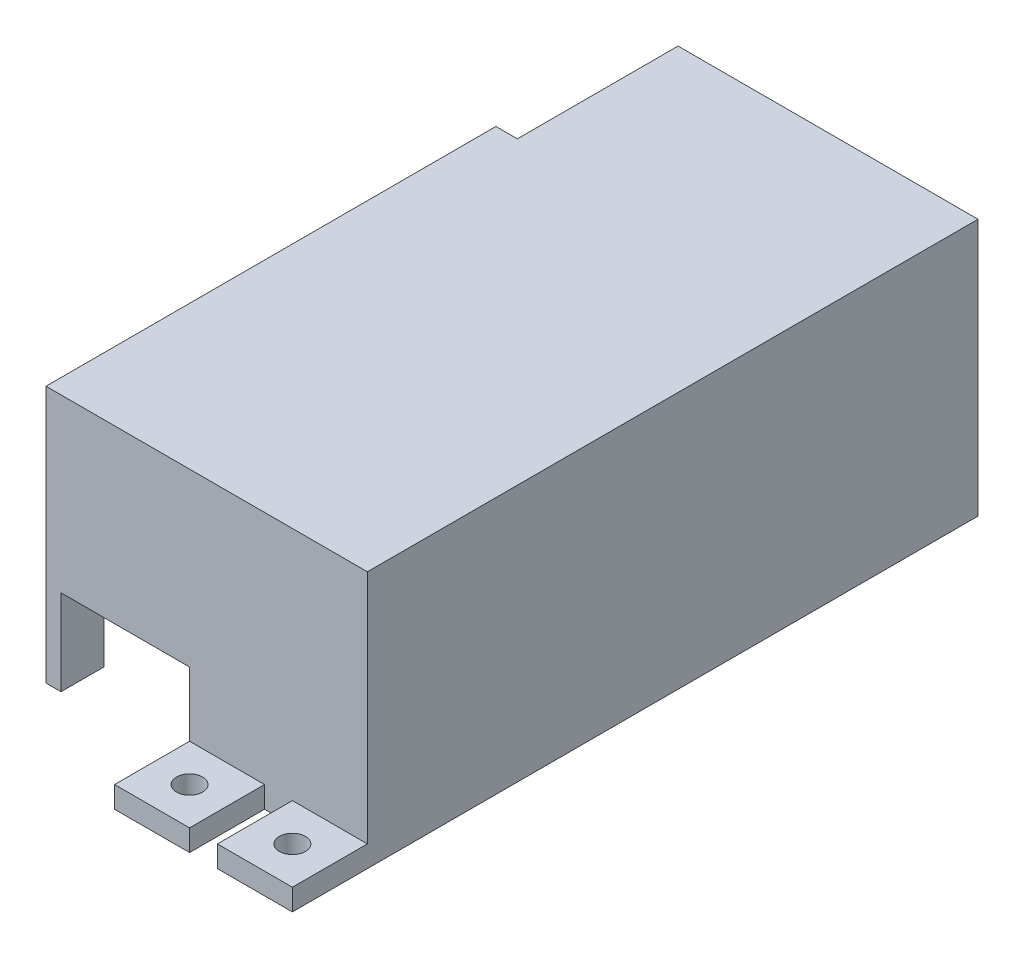
ISO-10303-21;
HEADER;
FILE_DESCRIPTION(('STEP AP214'),'2;1');
FILE_NAME('part.step','',(''),(''),'','','');
FILE_SCHEMA(('AUTOMOTIVE_DESIGN { 1 0 10303 214 1 1 1 1 }'));
ENDSEC;
DATA;
#1=APPLICATION_CONTEXT('core data for automotive mechanical design processes');
#2=APPLICATION_PROTOCOL_DEFINITION('international standard','automotive_design',2000,#1);
#3=PRODUCT_CONTEXT('',#1,'mechanical');
#4=PRODUCT('Part','Part','',(#3));
#5=PRODUCT_RELATED_PRODUCT_CATEGORY('part','',(#4));
#6=PRODUCT_DEFINITION_FORMATION('','',#4);
#7=PRODUCT_DEFINITION_CONTEXT('part definition',#1,'design');
#8=PRODUCT_DEFINITION('design','',#6,#7);
#9=PRODUCT_DEFINITION_SHAPE('','',#8);
#10=(LENGTH_UNIT() NAMED_UNIT(*) SI_UNIT(.MILLI.,.METRE.));
#11=(NAMED_UNIT(*) PLANE_ANGLE_UNIT() SI_UNIT($,.RADIAN.));
#12=(NAMED_UNIT(*) SI_UNIT($,.STERADIAN.) SOLID_ANGLE_UNIT());
#13=UNCERTAINTY_MEASURE_WITH_UNIT(LENGTH_MEASURE(1.E-05),#10,'distance_accuracy_value','');
#14=(GEOMETRIC_REPRESENTATION_CONTEXT(3) GLOBAL_UNCERTAINTY_ASSIGNED_CONTEXT((#13)) GLOBAL_UNIT_ASSIGNED_CONTEXT((#10,
#11,#12)) REPRESENTATION_CONTEXT('',''));
#15=CARTESIAN_POINT('',(0.,0.,0.));
#16=DIRECTION('',(0.,0.,1.));
#17=DIRECTION('',(1.,0.,0.));
#18=AXIS2_PLACEMENT_3D('',#15,#16,#17);
#19=CARTESIAN_POINT('',(0.,0.,0.));
#20=DIRECTION('',(0.,-1.,0.));
#21=DIRECTION('',(0.,0.,-1.));
#22=AXIS2_PLACEMENT_3D('',#19,#20,#21);
#23=PLANE('',#22);
#24=DIRECTION('',(-1.,0.,0.));
#25=VECTOR('',#24,1.);
#26=CARTESIAN_POINT('',(11.684,0.,-48.26));
#27=LINE('',#26,#25);
#28=CARTESIAN_POINT('',(1.778,0.,-48.26));
#29=VERTEX_POINT('',#28);
#30=CARTESIAN_POINT('',(0.,0.,-48.26));
#31=VERTEX_POINT('',#30);
#32=EDGE_CURVE('E211',#29,#31,#27,.T.);
#33=ORIENTED_EDGE('',*,*,#32,.T.);
#34=DIRECTION('',(0.,0.,1.));
#35=VECTOR('',#34,1.);
#36=CARTESIAN_POINT('',(0.,0.,0.));
#37=LINE('',#36,#35);
#38=CARTESIAN_POINT('',(0.,0.,-53.34));
#39=VERTEX_POINT('',#38);
#40=EDGE_CURVE('E227',#39,#31,#37,.T.);
#41=ORIENTED_EDGE('',*,*,#40,.F.);
#42=DIRECTION('',(-1.,0.,0.));
#43=VECTOR('',#42,1.);
#44=CARTESIAN_POINT('',(0.,0.,-53.34));
#45=LINE('',#44,#43);
#46=CARTESIAN_POINT('',(2.54,0.,-53.34));
#47=VERTEX_POINT('',#46);
#48=EDGE_CURVE('E265',#47,#39,#45,.T.);
#49=ORIENTED_EDGE('',*,*,#48,.F.);
#50=DIRECTION('',(0.,0.,1.));
#51=VECTOR('',#50,1.);
#52=CARTESIAN_POINT('',(2.54,0.,-53.34));
#53=LINE('',#52,#51);
#54=CARTESIAN_POINT('',(2.54000000000001,0.,-72.39));
#55=VERTEX_POINT('',#54);
#56=EDGE_CURVE('E262',#55,#47,#53,.T.);
#57=ORIENTED_EDGE('',*,*,#56,.F.);
#58=DIRECTION('',(-1.,0.,0.));
#59=VECTOR('',#58,1.);
#60=CARTESIAN_POINT('',(38.1,0.,-72.39));
#61=LINE('',#60,#59);
#62=CARTESIAN_POINT('',(38.1,0.,-72.39));
#63=VERTEX_POINT('',#62);
#64=EDGE_CURVE('E259',#63,#55,#61,.T.);
#65=ORIENTED_EDGE('',*,*,#64,.F.);
#66=DIRECTION('',(0.,0.,-1.));
#67=VECTOR('',#66,1.);
#68=CARTESIAN_POINT('',(38.1,0.,-53.34));
#69=LINE('',#68,#67);
#70=CARTESIAN_POINT('',(38.1,0.,8.89));
#71=VERTEX_POINT('',#70);
#72=EDGE_CURVE('E256',#71,#63,#69,.T.);
#73=ORIENTED_EDGE('',*,*,#72,.F.);
#74=DIRECTION('',(1.,0.,0.));
#75=VECTOR('',#74,1.);
#76=CARTESIAN_POINT('',(38.1,0.,8.89));
#77=LINE('',#76,#75);
#78=CARTESIAN_POINT('',(29.21,0.,8.89));
#79=VERTEX_POINT('',#78);
#80=EDGE_CURVE('E345',#79,#71,#77,.T.);
#81=ORIENTED_EDGE('',*,*,#80,.F.);
#82=DIRECTION('',(0.,0.,-1.));
#83=VECTOR('',#82,1.);
#84=CARTESIAN_POINT('',(29.21,0.,8.89));
#85=LINE('',#84,#83);
#86=CARTESIAN_POINT('',(29.21,0.,0.));
#87=VERTEX_POINT('',#86);
#88=EDGE_CURVE('E341',#79,#87,#85,.T.);
#89=ORIENTED_EDGE('',*,*,#88,.T.);
#90=DIRECTION('',(1.,0.,0.));
#91=VECTOR('',#90,1.);
#92=CARTESIAN_POINT('',(0.,0.,0.));
#93=LINE('',#92,#91);
#94=CARTESIAN_POINT('',(25.908,0.,0.));
#95=VERTEX_POINT('',#94);
#96=EDGE_CURVE('E240',#95,#87,#93,.T.);
#97=ORIENTED_EDGE('',*,*,#96,.F.);
#98=DIRECTION('',(0.,0.,-1.));
#99=VECTOR('',#98,1.);
#100=CARTESIAN_POINT('',(25.908,0.,8.89));
#101=LINE('',#100,#99);
#102=CARTESIAN_POINT('',(25.908,0.,8.89));
#103=VERTEX_POINT('',#102);
#104=EDGE_CURVE('E392',#103,#95,#101,.T.);
#105=ORIENTED_EDGE('',*,*,#104,.F.);
#106=DIRECTION('',(1.,0.,0.));
#107=VECTOR('',#106,1.);
#108=CARTESIAN_POINT('',(17.018,0.,8.89));
#109=LINE('',#108,#107);
#110=CARTESIAN_POINT('',(17.018,0.,8.89));
#111=VERTEX_POINT('',#110);
#112=EDGE_CURVE('E369',#111,#103,#109,.T.);
#113=ORIENTED_EDGE('',*,*,#112,.F.);
#114=DIRECTION('',(0.,0.,1.));
#115=VECTOR('',#114,1.);
#116=CARTESIAN_POINT('',(17.018,0.,-72.391));
#117=LINE('',#116,#115);
#118=CARTESIAN_POINT('',(17.018,0.,-1.77800000000003));
#119=VERTEX_POINT('',#118);
#120=EDGE_CURVE('E407',#119,#111,#117,.T.);
#121=ORIENTED_EDGE('',*,*,#120,.F.);
#122=DIRECTION('',(1.,0.,0.));
#123=VECTOR('',#122,1.);
#124=CARTESIAN_POINT('',(0.,0.,-1.778));
#125=LINE('',#124,#123);
#126=CARTESIAN_POINT('',(36.322,0.,-1.778));
#127=VERTEX_POINT('',#126);
#128=EDGE_CURVE('E464',#119,#127,#125,.T.);
#129=ORIENTED_EDGE('',*,*,#128,.T.);
#130=DIRECTION('',(0.,0.,-1.));
#131=VECTOR('',#130,1.);
#132=CARTESIAN_POINT('',(36.322,0.,0.));
#133=LINE('',#132,#131);
#134=CARTESIAN_POINT('',(36.322,0.,-70.612));
#135=VERTEX_POINT('',#134);
#136=EDGE_CURVE('E475',#127,#135,#133,.T.);
#137=ORIENTED_EDGE('',*,*,#136,.T.);
#138=DIRECTION('',(-1.,0.,0.));
#139=VECTOR('',#138,1.);
#140=CARTESIAN_POINT('',(0.,0.,-70.612));
#141=LINE('',#140,#139);
#142=CARTESIAN_POINT('',(4.31800000000001,0.,-70.612));
#143=VERTEX_POINT('',#142);
#144=EDGE_CURVE('E471',#135,#143,#141,.T.);
#145=ORIENTED_EDGE('',*,*,#144,.T.);
#146=DIRECTION('',(0.,0.,1.));
#147=VECTOR('',#146,1.);
#148=CARTESIAN_POINT('',(4.31799999999996,0.,0.));
#149=LINE('',#148,#147);
#150=CARTESIAN_POINT('',(4.318,0.,-51.562));
#151=VERTEX_POINT('',#150);
#152=EDGE_CURVE('E467',#143,#151,#149,.T.);
#153=ORIENTED_EDGE('',*,*,#152,.T.);
#154=DIRECTION('',(-1.,0.,0.));
#155=VECTOR('',#154,1.);
#156=CARTESIAN_POINT('',(2.81719092498633E-13,0.,-51.562));
#157=LINE('',#156,#155);
#158=CARTESIAN_POINT('',(1.778,0.,-51.562));
#159=VERTEX_POINT('',#158);
#160=EDGE_CURVE('E432',#151,#159,#157,.T.);
#161=ORIENTED_EDGE('',*,*,#160,.T.);
#162=DIRECTION('',(0.,0.,1.));
#163=VECTOR('',#162,1.);
#164=CARTESIAN_POINT('',(1.778,0.,0.));
#165=LINE('',#164,#163);
#166=EDGE_CURVE('E230',#159,#29,#165,.T.);
#167=ORIENTED_EDGE('',*,*,#166,.T.);
#168=EDGE_LOOP('',(#33,#41,#49,#57,#65,#73,#81,#89,#97,#105,#113,#121,#129,#137,#145,#153,#161,#167));
#169=FACE_BOUND('',#168,.T.);
#170=CARTESIAN_POINT('',(33.655,0.,4.445));
#171=DIRECTION('',(0.,1.,0.));
#172=DIRECTION('',(-1.,0.,0.));
#173=AXIS2_PLACEMENT_3D('',#170,#171,#172);
#174=CIRCLE('',#173,1.54999999999999);
#175=CARTESIAN_POINT('',(32.105,0.,4.445));
#176=VERTEX_POINT('',#175);
#177=EDGE_CURVE('E318',#176,#176,#174,.T.);
#178=ORIENTED_EDGE('',*,*,#177,.T.);
#179=EDGE_LOOP('',(#178));
#180=FACE_BOUND('',#179,.T.);
#181=CARTESIAN_POINT('',(21.463,0.,4.445));
#182=DIRECTION('',(0.,1.,0.));
#183=DIRECTION('',(0.,0.,1.));
#184=AXIS2_PLACEMENT_3D('',#181,#182,#183);
#185=CIRCLE('',#184,1.55);
#186=CARTESIAN_POINT('',(21.463,0.,5.995));
#187=VERTEX_POINT('',#186);
#188=EDGE_CURVE('E327',#187,#187,#185,.T.);
#189=ORIENTED_EDGE('',*,*,#188,.T.);
#190=EDGE_LOOP('',(#189));
#191=FACE_BOUND('',#190,.T.);
#192=ADVANCED_FACE('F41',(#169,#180,#191),#23,.T.);
#193=CARTESIAN_POINT('',(0.,30.48,0.));
#194=DIRECTION('',(0.,0.,-1.));
#195=DIRECTION('',(-1.,0.,0.));
#196=AXIS2_PLACEMENT_3D('',#193,#194,#195);
#197=PLANE('',#196);
#198=DIRECTION('',(-1.,0.,0.));
#199=VECTOR('',#198,1.);
#200=CARTESIAN_POINT('',(38.1,2.54,0.));
#201=LINE('',#200,#199);
#202=CARTESIAN_POINT('',(38.1,2.54,0.));
#203=VERTEX_POINT('',#202);
#204=CARTESIAN_POINT('',(29.21,2.54,0.));
#205=VERTEX_POINT('',#204);
#206=EDGE_CURVE('E349',#203,#205,#201,.T.);
#207=ORIENTED_EDGE('',*,*,#206,.F.);
#208=DIRECTION('',(0.,-1.,0.));
#209=VECTOR('',#208,1.);
#210=CARTESIAN_POINT('',(38.1,30.48,0.));
#211=LINE('',#210,#209);
#212=CARTESIAN_POINT('',(38.1,30.48,0.));
#213=VERTEX_POINT('',#212);
#214=EDGE_CURVE('E283',#213,#203,#211,.T.);
#215=ORIENTED_EDGE('',*,*,#214,.F.);
#216=DIRECTION('',(1.,0.,0.));
#217=VECTOR('',#216,1.);
#218=CARTESIAN_POINT('',(0.,30.48,0.));
#219=LINE('',#218,#217);
#220=CARTESIAN_POINT('',(0.,30.48,0.));
#221=VERTEX_POINT('',#220);
#222=EDGE_CURVE('E484',#221,#213,#219,.T.);
#223=ORIENTED_EDGE('',*,*,#222,.F.);
#224=DIRECTION('',(0.,-1.,0.));
#225=VECTOR('',#224,1.);
#226=CARTESIAN_POINT('',(0.,30.48,0.));
#227=LINE('',#226,#225);
#228=CARTESIAN_POINT('',(0.,0.,0.));
#229=VERTEX_POINT('',#228);
#230=EDGE_CURVE('E287',#221,#229,#227,.T.);
#231=ORIENTED_EDGE('',*,*,#230,.T.);
#232=CARTESIAN_POINT('',(1.778,0.,0.));
#233=VERTEX_POINT('',#232);
#234=EDGE_CURVE('E246',#229,#233,#93,.T.);
#235=ORIENTED_EDGE('',*,*,#234,.T.);
#236=DIRECTION('',(0.,-1.,0.));
#237=VECTOR('',#236,1.);
#238=CARTESIAN_POINT('',(1.778,0.,0.));
#239=LINE('',#238,#237);
#240=CARTESIAN_POINT('',(1.778,10.16,0.));
#241=VERTEX_POINT('',#240);
#242=EDGE_CURVE('E404',#241,#233,#239,.T.);
#243=ORIENTED_EDGE('',*,*,#242,.F.);
#244=DIRECTION('',(-1.,0.,0.));
#245=VECTOR('',#244,1.);
#246=CARTESIAN_POINT('',(1.778,10.16,0.));
#247=LINE('',#246,#245);
#248=CARTESIAN_POINT('',(17.018,10.16,0.));
#249=VERTEX_POINT('',#248);
#250=EDGE_CURVE('E397',#249,#241,#247,.T.);
#251=ORIENTED_EDGE('',*,*,#250,.F.);
#252=DIRECTION('',(0.,1.,0.));
#253=VECTOR('',#252,1.);
#254=CARTESIAN_POINT('',(17.018,0.,0.));
#255=LINE('',#254,#253);
#256=CARTESIAN_POINT('',(17.018,2.54,0.));
#257=VERTEX_POINT('',#256);
#258=EDGE_CURVE('E401',#257,#249,#255,.T.);
#259=ORIENTED_EDGE('',*,*,#258,.F.);
#260=DIRECTION('',(-1.,0.,0.));
#261=VECTOR('',#260,1.);
#262=CARTESIAN_POINT('',(17.018,2.54,0.));
#263=LINE('',#262,#261);
#264=CARTESIAN_POINT('',(25.908,2.54,0.));
#265=VERTEX_POINT('',#264);
#266=EDGE_CURVE('E370',#265,#257,#263,.T.);
#267=ORIENTED_EDGE('',*,*,#266,.F.);
#268=DIRECTION('',(0.,1.,0.));
#269=VECTOR('',#268,1.);
#270=CARTESIAN_POINT('',(25.908,0.,0.));
#271=LINE('',#270,#269);
#272=EDGE_CURVE('E65',#95,#265,#271,.T.);
#273=ORIENTED_EDGE('',*,*,#272,.F.);
#274=ORIENTED_EDGE('',*,*,#96,.T.);
#275=DIRECTION('',(0.,-1.,0.));
#276=VECTOR('',#275,1.);
#277=CARTESIAN_POINT('',(29.21,0.,0.));
#278=LINE('',#277,#276);
#279=EDGE_CURVE('E346',#205,#87,#278,.T.);
#280=ORIENTED_EDGE('',*,*,#279,.F.);
#281=EDGE_LOOP('',(#207,#215,#223,#231,#235,#243,#251,#259,#267,#273,#274,#280));
#282=FACE_BOUND('',#281,.T.);
#283=ADVANCED_FACE('F506',(#282),#197,.F.);
#284=DIRECTION('',(-1.,0.,0.));
#285=VECTOR('',#284,1.);
#286=CARTESIAN_POINT('',(11.684,0.,-5.08));
#287=LINE('',#286,#285);
#288=CARTESIAN_POINT('',(1.778,0.,-5.08));
#289=VERTEX_POINT('',#288);
#290=CARTESIAN_POINT('',(0.,0.,-5.08));
#291=VERTEX_POINT('',#290);
#292=EDGE_CURVE('E232',#289,#291,#287,.T.);
#293=ORIENTED_EDGE('',*,*,#292,.F.);
#294=EDGE_CURVE('E303',#289,#233,#165,.T.);
#295=ORIENTED_EDGE('',*,*,#294,.T.);
#296=ORIENTED_EDGE('',*,*,#234,.F.);
#297=EDGE_CURVE('E241',#291,#229,#37,.T.);
#298=ORIENTED_EDGE('',*,*,#297,.F.);
#299=EDGE_LOOP('',(#293,#295,#296,#298));
#300=FACE_BOUND('',#299,.T.);
#301=ADVANCED_FACE('F309',(#300),#23,.T.);
#302=CARTESIAN_POINT('',(0.,30.48,0.));
#303=DIRECTION('',(1.,0.,0.));
#304=DIRECTION('',(0.,0.,-1.));
#305=AXIS2_PLACEMENT_3D('',#302,#303,#304);
#306=PLANE('',#305);
#307=ORIENTED_EDGE('',*,*,#40,.T.);
#308=DIRECTION('',(0.,-1.,0.));
#309=VECTOR('',#308,1.);
#310=CARTESIAN_POINT('',(0.,22.86,-48.26));
#311=LINE('',#310,#309);
#312=CARTESIAN_POINT('',(0.,22.86,-48.26));
#313=VERTEX_POINT('',#312);
#314=EDGE_CURVE('E208',#313,#31,#311,.T.);
#315=ORIENTED_EDGE('',*,*,#314,.F.);
#316=DIRECTION('',(0.,0.,-1.));
#317=VECTOR('',#316,1.);
#318=CARTESIAN_POINT('',(0.,22.86,-48.26));
#319=LINE('',#318,#317);
#320=CARTESIAN_POINT('',(0.,22.86,-5.08));
#321=VERTEX_POINT('',#320);
#322=EDGE_CURVE('E233',#321,#313,#319,.T.);
#323=ORIENTED_EDGE('',*,*,#322,.F.);
#324=DIRECTION('',(0.,1.,0.));
#325=VECTOR('',#324,1.);
#326=CARTESIAN_POINT('',(0.,22.86,-5.08));
#327=LINE('',#326,#325);
#328=EDGE_CURVE('E220',#291,#321,#327,.T.);
#329=ORIENTED_EDGE('',*,*,#328,.F.);
#330=ORIENTED_EDGE('',*,*,#297,.T.);
#331=ORIENTED_EDGE('',*,*,#230,.F.);
#332=DIRECTION('',(0.,0.,1.));
#333=VECTOR('',#332,1.);
#334=CARTESIAN_POINT('',(0.,30.48,0.));
#335=LINE('',#334,#333);
#336=CARTESIAN_POINT('',(0.,30.48,-53.34));
#337=VERTEX_POINT('',#336);
#338=EDGE_CURVE('E268',#337,#221,#335,.T.);
#339=ORIENTED_EDGE('',*,*,#338,.F.);
#340=DIRECTION('',(0.,-1.,0.));
#341=VECTOR('',#340,1.);
#342=CARTESIAN_POINT('',(0.,30.48,-53.34));
#343=LINE('',#342,#341);
#344=EDGE_CURVE('E238',#337,#39,#343,.T.);
#345=ORIENTED_EDGE('',*,*,#344,.T.);
#346=EDGE_LOOP('',(#307,#315,#323,#329,#330,#331,#339,#345));
#347=FACE_BOUND('',#346,.T.);
#348=ADVANCED_FACE('F43',(#347),#306,.F.);
#349=CARTESIAN_POINT('',(38.1,30.48,-53.34));
#350=DIRECTION('',(-1.,0.,0.));
#351=DIRECTION('',(0.,0.,1.));
#352=AXIS2_PLACEMENT_3D('',#349,#350,#351);
#353=PLANE('',#352);
#354=ORIENTED_EDGE('',*,*,#72,.T.);
#355=DIRECTION('',(0.,-1.,0.));
#356=VECTOR('',#355,1.);
#357=CARTESIAN_POINT('',(38.1,30.48,-72.39));
#358=LINE('',#357,#356);
#359=CARTESIAN_POINT('',(38.1,30.48,-72.39));
#360=VERTEX_POINT('',#359);
#361=EDGE_CURVE('E279',#360,#63,#358,.T.);
#362=ORIENTED_EDGE('',*,*,#361,.F.);
#363=DIRECTION('',(0.,0.,-1.));
#364=VECTOR('',#363,1.);
#365=CARTESIAN_POINT('',(38.1,30.48,0.));
#366=LINE('',#365,#364);
#367=EDGE_CURVE('E487',#213,#360,#366,.T.);
#368=ORIENTED_EDGE('',*,*,#367,.F.);
#369=ORIENTED_EDGE('',*,*,#214,.T.);
#370=DIRECTION('',(0.,0.,-1.));
#371=VECTOR('',#370,1.);
#372=CARTESIAN_POINT('',(38.1,2.54,8.89));
#373=LINE('',#372,#371);
#374=CARTESIAN_POINT('',(38.1,2.54,8.89));
#375=VERTEX_POINT('',#374);
#376=EDGE_CURVE('E331',#375,#203,#373,.T.);
#377=ORIENTED_EDGE('',*,*,#376,.F.);
#378=DIRECTION('',(0.,1.,0.));
#379=VECTOR('',#378,1.);
#380=CARTESIAN_POINT('',(38.1,0.,8.89));
#381=LINE('',#380,#379);
#382=EDGE_CURVE('E350',#71,#375,#381,.T.);
#383=ORIENTED_EDGE('',*,*,#382,.F.);
#384=EDGE_LOOP('',(#354,#362,#368,#369,#377,#383));
#385=FACE_BOUND('',#384,.T.);
#386=ADVANCED_FACE('F514',(#385),#353,.F.);
#387=CARTESIAN_POINT('',(38.1,30.48,-72.39));
#388=DIRECTION('',(0.,0.,1.));
#389=DIRECTION('',(1.,0.,0.));
#390=AXIS2_PLACEMENT_3D('',#387,#388,#389);
#391=PLANE('',#390);
#392=ORIENTED_EDGE('',*,*,#64,.T.);
#393=DIRECTION('',(0.,-1.,0.));
#394=VECTOR('',#393,1.);
#395=CARTESIAN_POINT('',(2.54000000000001,30.48,-72.39));
#396=LINE('',#395,#394);
#397=CARTESIAN_POINT('',(2.54000000000001,30.48,-72.39));
#398=VERTEX_POINT('',#397);
#399=EDGE_CURVE('E275',#398,#55,#396,.T.);
#400=ORIENTED_EDGE('',*,*,#399,.F.);
#401=DIRECTION('',(-1.,0.,0.));
#402=VECTOR('',#401,1.);
#403=CARTESIAN_POINT('',(38.1,30.48,-72.39));
#404=LINE('',#403,#402);
#405=EDGE_CURVE('E490',#360,#398,#404,.T.);
#406=ORIENTED_EDGE('',*,*,#405,.F.);
#407=ORIENTED_EDGE('',*,*,#361,.T.);
#408=EDGE_LOOP('',(#392,#400,#406,#407));
#409=FACE_BOUND('',#408,.T.);
#410=ADVANCED_FACE('F518',(#409),#391,.F.);
#411=CARTESIAN_POINT('',(2.54,30.48,-53.34));
#412=DIRECTION('',(1.,0.,0.));
#413=DIRECTION('',(0.,0.,-1.));
#414=AXIS2_PLACEMENT_3D('',#411,#412,#413);
#415=PLANE('',#414);
#416=ORIENTED_EDGE('',*,*,#56,.T.);
#417=DIRECTION('',(0.,-1.,0.));
#418=VECTOR('',#417,1.);
#419=CARTESIAN_POINT('',(2.54,30.48,-53.34));
#420=LINE('',#419,#418);
#421=CARTESIAN_POINT('',(2.54,30.48,-53.34));
#422=VERTEX_POINT('',#421);
#423=EDGE_CURVE('E271',#422,#47,#420,.T.);
#424=ORIENTED_EDGE('',*,*,#423,.F.);
#425=DIRECTION('',(0.,0.,1.));
#426=VECTOR('',#425,1.);
#427=CARTESIAN_POINT('',(2.54,30.48,-53.34));
#428=LINE('',#427,#426);
#429=EDGE_CURVE('E492',#398,#422,#428,.T.);
#430=ORIENTED_EDGE('',*,*,#429,.F.);
#431=ORIENTED_EDGE('',*,*,#399,.T.);
#432=EDGE_LOOP('',(#416,#424,#430,#431));
#433=FACE_BOUND('',#432,.T.);
#434=ADVANCED_FACE('F521',(#433),#415,.F.);
#435=CARTESIAN_POINT('',(0.,30.48,-53.34));
#436=DIRECTION('',(0.,0.,1.));
#437=DIRECTION('',(1.,0.,0.));
#438=AXIS2_PLACEMENT_3D('',#435,#436,#437);
#439=PLANE('',#438);
#440=ORIENTED_EDGE('',*,*,#48,.T.);
#441=ORIENTED_EDGE('',*,*,#344,.F.);
#442=DIRECTION('',(-1.,0.,0.));
#443=VECTOR('',#442,1.);
#444=CARTESIAN_POINT('',(0.,30.48,-53.34));
#445=LINE('',#444,#443);
#446=EDGE_CURVE('E251',#422,#337,#445,.T.);
#447=ORIENTED_EDGE('',*,*,#446,.F.);
#448=ORIENTED_EDGE('',*,*,#423,.T.);
#449=EDGE_LOOP('',(#440,#441,#447,#448));
#450=FACE_BOUND('',#449,.T.);
#451=ADVANCED_FACE('F504',(#450),#439,.F.);
#452=CARTESIAN_POINT('',(0.,30.48,0.));
#453=DIRECTION('',(0.,-1.,0.));
#454=DIRECTION('',(0.,0.,-1.));
#455=AXIS2_PLACEMENT_3D('',#452,#453,#454);
#456=PLANE('',#455);
#457=ORIENTED_EDGE('',*,*,#338,.T.);
#458=ORIENTED_EDGE('',*,*,#222,.T.);
#459=ORIENTED_EDGE('',*,*,#367,.T.);
#460=ORIENTED_EDGE('',*,*,#405,.T.);
#461=ORIENTED_EDGE('',*,*,#429,.T.);
#462=ORIENTED_EDGE('',*,*,#446,.T.);
#463=EDGE_LOOP('',(#457,#458,#459,#460,#461,#462));
#464=FACE_BOUND('',#463,.T.);
#465=ADVANCED_FACE('F501',(#464),#456,.F.);
#466=CARTESIAN_POINT('',(1.778,30.48,0.));
#467=DIRECTION('',(1.,0.,0.));
#468=DIRECTION('',(0.,0.,-1.));
#469=AXIS2_PLACEMENT_3D('',#466,#467,#468);
#470=PLANE('',#469);
#471=DIRECTION('',(0.,1.,0.));
#472=VECTOR('',#471,1.);
#473=CARTESIAN_POINT('',(1.778,30.48,-48.26));
#474=LINE('',#473,#472);
#475=CARTESIAN_POINT('',(1.778,22.86,-48.26));
#476=VERTEX_POINT('',#475);
#477=EDGE_CURVE('E11',#29,#476,#474,.T.);
#478=ORIENTED_EDGE('',*,*,#477,.F.);
#479=ORIENTED_EDGE('',*,*,#166,.F.);
#480=DIRECTION('',(0.,-1.,0.));
#481=VECTOR('',#480,1.);
#482=CARTESIAN_POINT('',(1.778,30.48,-51.562));
#483=LINE('',#482,#481);
#484=CARTESIAN_POINT('',(1.778,28.702,-51.562));
#485=VERTEX_POINT('',#484);
#486=EDGE_CURVE('E433',#485,#159,#483,.T.);
#487=ORIENTED_EDGE('',*,*,#486,.F.);
#488=DIRECTION('',(0.,0.,1.));
#489=VECTOR('',#488,1.);
#490=CARTESIAN_POINT('',(1.778,28.702,0.));
#491=LINE('',#490,#489);
#492=CARTESIAN_POINT('',(1.778,28.702,-1.778));
#493=VERTEX_POINT('',#492);
#494=EDGE_CURVE('E427',#485,#493,#491,.T.);
#495=ORIENTED_EDGE('',*,*,#494,.T.);
#496=DIRECTION('',(0.,-1.,0.));
#497=VECTOR('',#496,1.);
#498=CARTESIAN_POINT('',(1.778,30.48,-1.778));
#499=LINE('',#498,#497);
#500=CARTESIAN_POINT('',(1.778,10.16,-1.778));
#501=VERTEX_POINT('',#500);
#502=EDGE_CURVE('E249',#493,#501,#499,.T.);
#503=ORIENTED_EDGE('',*,*,#502,.T.);
#504=DIRECTION('',(0.,0.,1.));
#505=VECTOR('',#504,1.);
#506=CARTESIAN_POINT('',(1.778,10.16,-72.391));
#507=LINE('',#506,#505);
#508=EDGE_CURVE('E411',#501,#241,#507,.T.);
#509=ORIENTED_EDGE('',*,*,#508,.T.);
#510=ORIENTED_EDGE('',*,*,#242,.T.);
#511=ORIENTED_EDGE('',*,*,#294,.F.);
#512=DIRECTION('',(0.,-1.,0.));
#513=VECTOR('',#512,1.);
#514=CARTESIAN_POINT('',(1.778,30.48,-5.08));
#515=LINE('',#514,#513);
#516=CARTESIAN_POINT('',(1.778,22.86,-5.08));
#517=VERTEX_POINT('',#516);
#518=EDGE_CURVE('E291',#517,#289,#515,.T.);
#519=ORIENTED_EDGE('',*,*,#518,.F.);
#520=DIRECTION('',(0.,0.,1.));
#521=VECTOR('',#520,1.);
#522=CARTESIAN_POINT('',(1.778,22.86,0.));
#523=LINE('',#522,#521);
#524=EDGE_CURVE('E50',#476,#517,#523,.T.);
#525=ORIENTED_EDGE('',*,*,#524,.F.);
#526=EDGE_LOOP('',(#478,#479,#487,#495,#503,#509,#510,#511,#519,#525));
#527=FACE_BOUND('',#526,.T.);
#528=ADVANCED_FACE('F301',(#527),#470,.T.);
#529=CARTESIAN_POINT('',(0.,30.48,-1.778));
#530=DIRECTION('',(0.,0.,-1.));
#531=DIRECTION('',(-1.,0.,0.));
#532=AXIS2_PLACEMENT_3D('',#529,#530,#531);
#533=PLANE('',#532);
#534=DIRECTION('',(-1.,0.,0.));
#535=VECTOR('',#534,1.);
#536=CARTESIAN_POINT('',(1.778,10.16,-1.778));
#537=LINE('',#536,#535);
#538=CARTESIAN_POINT('',(17.018,10.16,-1.778));
#539=VERTEX_POINT('',#538);
#540=EDGE_CURVE('E396',#539,#501,#537,.T.);
#541=ORIENTED_EDGE('',*,*,#540,.T.);
#542=ORIENTED_EDGE('',*,*,#502,.F.);
#543=DIRECTION('',(1.,0.,0.));
#544=VECTOR('',#543,1.);
#545=CARTESIAN_POINT('',(0.,28.702,-1.778));
#546=LINE('',#545,#544);
#547=CARTESIAN_POINT('',(36.322,28.702,-1.778));
#548=VERTEX_POINT('',#547);
#549=EDGE_CURVE('E431',#493,#548,#546,.T.);
#550=ORIENTED_EDGE('',*,*,#549,.T.);
#551=DIRECTION('',(0.,-1.,0.));
#552=VECTOR('',#551,1.);
#553=CARTESIAN_POINT('',(36.322,30.48,-1.778));
#554=LINE('',#553,#552);
#555=EDGE_CURVE('E426',#548,#127,#554,.T.);
#556=ORIENTED_EDGE('',*,*,#555,.T.);
#557=ORIENTED_EDGE('',*,*,#128,.F.);
#558=DIRECTION('',(0.,1.,0.));
#559=VECTOR('',#558,1.);
#560=CARTESIAN_POINT('',(17.018,0.,-1.77800000000002));
#561=LINE('',#560,#559);
#562=EDGE_CURVE('E412',#119,#539,#561,.T.);
#563=ORIENTED_EDGE('',*,*,#562,.T.);
#564=EDGE_LOOP('',(#541,#542,#550,#556,#557,#563));
#565=FACE_BOUND('',#564,.T.);
#566=ADVANCED_FACE('F549',(#565),#533,.T.);
#567=CARTESIAN_POINT('',(36.322,30.48,-53.34));
#568=DIRECTION('',(-1.,0.,0.));
#569=DIRECTION('',(0.,0.,1.));
#570=AXIS2_PLACEMENT_3D('',#567,#568,#569);
#571=PLANE('',#570);
#572=ORIENTED_EDGE('',*,*,#136,.F.);
#573=ORIENTED_EDGE('',*,*,#555,.F.);
#574=DIRECTION('',(0.,0.,-1.));
#575=VECTOR('',#574,1.);
#576=CARTESIAN_POINT('',(36.322,28.702,0.));
#577=LINE('',#576,#575);
#578=CARTESIAN_POINT('',(36.322,28.702,-70.612));
#579=VERTEX_POINT('',#578);
#580=EDGE_CURVE('E444',#548,#579,#577,.T.);
#581=ORIENTED_EDGE('',*,*,#580,.T.);
#582=DIRECTION('',(0.,-1.,0.));
#583=VECTOR('',#582,1.);
#584=CARTESIAN_POINT('',(36.322,30.48,-70.612));
#585=LINE('',#584,#583);
#586=EDGE_CURVE('E441',#579,#135,#585,.T.);
#587=ORIENTED_EDGE('',*,*,#586,.T.);
#588=EDGE_LOOP('',(#572,#573,#581,#587));
#589=FACE_BOUND('',#588,.T.);
#590=ADVANCED_FACE('F555',(#589),#571,.T.);
#591=CARTESIAN_POINT('',(38.1,30.48,-70.612));
#592=DIRECTION('',(0.,0.,1.));
#593=DIRECTION('',(1.,0.,0.));
#594=AXIS2_PLACEMENT_3D('',#591,#592,#593);
#595=PLANE('',#594);
#596=ORIENTED_EDGE('',*,*,#144,.F.);
#597=ORIENTED_EDGE('',*,*,#586,.F.);
#598=DIRECTION('',(-1.,0.,0.));
#599=VECTOR('',#598,1.);
#600=CARTESIAN_POINT('',(0.,28.702,-70.612));
#601=LINE('',#600,#599);
#602=CARTESIAN_POINT('',(4.31800000000001,28.702,-70.612));
#603=VERTEX_POINT('',#602);
#604=EDGE_CURVE('E450',#579,#603,#601,.T.);
#605=ORIENTED_EDGE('',*,*,#604,.T.);
#606=DIRECTION('',(0.,-1.,0.));
#607=VECTOR('',#606,1.);
#608=CARTESIAN_POINT('',(4.31800000000001,30.48,-70.612));
#609=LINE('',#608,#607);
#610=EDGE_CURVE('E447',#603,#143,#609,.T.);
#611=ORIENTED_EDGE('',*,*,#610,.T.);
#612=EDGE_LOOP('',(#596,#597,#605,#611));
#613=FACE_BOUND('',#612,.T.);
#614=ADVANCED_FACE('F560',(#613),#595,.T.);
#615=CARTESIAN_POINT('',(4.318,30.48,-53.34));
#616=DIRECTION('',(1.,0.,0.));
#617=DIRECTION('',(0.,0.,-1.));
#618=AXIS2_PLACEMENT_3D('',#615,#616,#617);
#619=PLANE('',#618);
#620=ORIENTED_EDGE('',*,*,#152,.F.);
#621=ORIENTED_EDGE('',*,*,#610,.F.);
#622=DIRECTION('',(0.,0.,1.));
#623=VECTOR('',#622,1.);
#624=CARTESIAN_POINT('',(4.31799999999996,28.702,0.));
#625=LINE('',#624,#623);
#626=CARTESIAN_POINT('',(4.318,28.702,-51.562));
#627=VERTEX_POINT('',#626);
#628=EDGE_CURVE('E455',#603,#627,#625,.T.);
#629=ORIENTED_EDGE('',*,*,#628,.T.);
#630=DIRECTION('',(0.,-1.,0.));
#631=VECTOR('',#630,1.);
#632=CARTESIAN_POINT('',(4.318,30.48,-51.562));
#633=LINE('',#632,#631);
#634=EDGE_CURVE('E436',#627,#151,#633,.T.);
#635=ORIENTED_EDGE('',*,*,#634,.T.);
#636=EDGE_LOOP('',(#620,#621,#629,#635));
#637=FACE_BOUND('',#636,.T.);
#638=ADVANCED_FACE('F565',(#637),#619,.T.);
#639=CARTESIAN_POINT('',(0.,30.48,-51.562));
#640=DIRECTION('',(0.,0.,1.));
#641=DIRECTION('',(1.,0.,0.));
#642=AXIS2_PLACEMENT_3D('',#639,#640,#641);
#643=PLANE('',#642);
#644=ORIENTED_EDGE('',*,*,#160,.F.);
#645=ORIENTED_EDGE('',*,*,#634,.F.);
#646=DIRECTION('',(-1.,0.,0.));
#647=VECTOR('',#646,1.);
#648=CARTESIAN_POINT('',(2.81719092498633E-13,28.702,-51.562));
#649=LINE('',#648,#647);
#650=EDGE_CURVE('E437',#627,#485,#649,.T.);
#651=ORIENTED_EDGE('',*,*,#650,.T.);
#652=ORIENTED_EDGE('',*,*,#486,.T.);
#653=EDGE_LOOP('',(#644,#645,#651,#652));
#654=FACE_BOUND('',#653,.T.);
#655=ADVANCED_FACE('F570',(#654),#643,.T.);
#656=CARTESIAN_POINT('',(0.,28.702,0.));
#657=DIRECTION('',(0.,-1.,0.));
#658=DIRECTION('',(0.,0.,-1.));
#659=AXIS2_PLACEMENT_3D('',#656,#657,#658);
#660=PLANE('',#659);
#661=ORIENTED_EDGE('',*,*,#494,.F.);
#662=ORIENTED_EDGE('',*,*,#650,.F.);
#663=ORIENTED_EDGE('',*,*,#628,.F.);
#664=ORIENTED_EDGE('',*,*,#604,.F.);
#665=ORIENTED_EDGE('',*,*,#580,.F.);
#666=ORIENTED_EDGE('',*,*,#549,.F.);
#667=EDGE_LOOP('',(#661,#662,#663,#664,#665,#666));
#668=FACE_BOUND('',#667,.T.);
#669=ADVANCED_FACE('F574',(#668),#660,.T.);
#670=CARTESIAN_POINT('',(1.778,10.16,-72.391));
#671=DIRECTION('',(0.,1.,0.));
#672=DIRECTION('',(0.,0.,1.));
#673=AXIS2_PLACEMENT_3D('',#670,#671,#672);
#674=PLANE('',#673);
#675=DIRECTION('',(0.,0.,1.));
#676=VECTOR('',#675,1.);
#677=CARTESIAN_POINT('',(17.018,10.16,-72.391));
#678=LINE('',#677,#676);
#679=EDGE_CURVE('E416',#539,#249,#678,.T.);
#680=ORIENTED_EDGE('',*,*,#679,.T.);
#681=ORIENTED_EDGE('',*,*,#250,.T.);
#682=ORIENTED_EDGE('',*,*,#508,.F.);
#683=ORIENTED_EDGE('',*,*,#540,.F.);
#684=EDGE_LOOP('',(#680,#681,#682,#683));
#685=FACE_BOUND('',#684,.T.);
#686=ADVANCED_FACE('F576',(#685),#674,.F.);
#687=CARTESIAN_POINT('',(17.018,0.,-72.391));
#688=DIRECTION('',(1.,0.,0.));
#689=DIRECTION('',(0.,0.,-1.));
#690=AXIS2_PLACEMENT_3D('',#687,#688,#689);
#691=PLANE('',#690);
#692=ORIENTED_EDGE('',*,*,#120,.T.);
#693=DIRECTION('',(0.,-1.,0.));
#694=VECTOR('',#693,1.);
#695=CARTESIAN_POINT('',(17.018,0.,8.89));
#696=LINE('',#695,#694);
#697=CARTESIAN_POINT('',(17.018,2.54,8.89));
#698=VERTEX_POINT('',#697);
#699=EDGE_CURVE('E365',#698,#111,#696,.T.);
#700=ORIENTED_EDGE('',*,*,#699,.F.);
#701=DIRECTION('',(0.,0.,-1.));
#702=VECTOR('',#701,1.);
#703=CARTESIAN_POINT('',(17.018,2.54,8.89));
#704=LINE('',#703,#702);
#705=EDGE_CURVE('E379',#698,#257,#704,.T.);
#706=ORIENTED_EDGE('',*,*,#705,.T.);
#707=ORIENTED_EDGE('',*,*,#258,.T.);
#708=ORIENTED_EDGE('',*,*,#679,.F.);
#709=ORIENTED_EDGE('',*,*,#562,.F.);
#710=EDGE_LOOP('',(#692,#700,#706,#707,#708,#709));
#711=FACE_BOUND('',#710,.T.);
#712=ADVANCED_FACE('F582',(#711),#691,.F.);
#713=CARTESIAN_POINT('',(25.908,0.,8.89));
#714=DIRECTION('',(-1.,0.,0.));
#715=DIRECTION('',(0.,0.,1.));
#716=AXIS2_PLACEMENT_3D('',#713,#714,#715);
#717=PLANE('',#716);
#718=ORIENTED_EDGE('',*,*,#272,.T.);
#719=DIRECTION('',(0.,0.,-1.));
#720=VECTOR('',#719,1.);
#721=CARTESIAN_POINT('',(25.908,2.54,8.89));
#722=LINE('',#721,#720);
#723=CARTESIAN_POINT('',(25.908,2.54,8.89));
#724=VERTEX_POINT('',#723);
#725=EDGE_CURVE('E388',#724,#265,#722,.T.);
#726=ORIENTED_EDGE('',*,*,#725,.F.);
#727=DIRECTION('',(0.,1.,0.));
#728=VECTOR('',#727,1.);
#729=CARTESIAN_POINT('',(25.908,0.,8.89));
#730=LINE('',#729,#728);
#731=EDGE_CURVE('E373',#103,#724,#730,.T.);
#732=ORIENTED_EDGE('',*,*,#731,.F.);
#733=ORIENTED_EDGE('',*,*,#104,.T.);
#734=EDGE_LOOP('',(#718,#726,#732,#733));
#735=FACE_BOUND('',#734,.T.);
#736=ADVANCED_FACE('F538',(#735),#717,.F.);
#737=CARTESIAN_POINT('',(17.018,2.54,8.89));
#738=DIRECTION('',(0.,-1.,0.));
#739=DIRECTION('',(0.,0.,-1.));
#740=AXIS2_PLACEMENT_3D('',#737,#738,#739);
#741=PLANE('',#740);
#742=CARTESIAN_POINT('',(21.463,2.54,4.445));
#743=DIRECTION('',(0.,1.,0.));
#744=DIRECTION('',(0.,0.,1.));
#745=AXIS2_PLACEMENT_3D('',#742,#743,#744);
#746=CIRCLE('',#745,1.55);
#747=CARTESIAN_POINT('',(21.463,2.54,5.995));
#748=VERTEX_POINT('',#747);
#749=EDGE_CURVE('E322',#748,#748,#746,.T.);
#750=ORIENTED_EDGE('',*,*,#749,.F.);
#751=EDGE_LOOP('',(#750));
#752=FACE_BOUND('',#751,.T.);
#753=ORIENTED_EDGE('',*,*,#266,.T.);
#754=ORIENTED_EDGE('',*,*,#705,.F.);
#755=DIRECTION('',(-1.,0.,0.));
#756=VECTOR('',#755,1.);
#757=CARTESIAN_POINT('',(17.018,2.54,8.89));
#758=LINE('',#757,#756);
#759=EDGE_CURVE('E376',#724,#698,#758,.T.);
#760=ORIENTED_EDGE('',*,*,#759,.F.);
#761=ORIENTED_EDGE('',*,*,#725,.T.);
#762=EDGE_LOOP('',(#753,#754,#760,#761));
#763=FACE_BOUND('',#762,.T.);
#764=ADVANCED_FACE('F690',(#752,#763),#741,.F.);
#765=CARTESIAN_POINT('',(0.,0.,8.89));
#766=DIRECTION('',(0.,0.,-1.));
#767=DIRECTION('',(-1.,0.,0.));
#768=AXIS2_PLACEMENT_3D('',#765,#766,#767);
#769=PLANE('',#768);
#770=ORIENTED_EDGE('',*,*,#699,.T.);
#771=ORIENTED_EDGE('',*,*,#112,.T.);
#772=ORIENTED_EDGE('',*,*,#731,.T.);
#773=ORIENTED_EDGE('',*,*,#759,.T.);
#774=EDGE_LOOP('',(#770,#771,#772,#773));
#775=FACE_BOUND('',#774,.T.);
#776=ADVANCED_FACE('F542',(#775),#769,.F.);
#777=CARTESIAN_POINT('',(38.1,2.54,8.89));
#778=DIRECTION('',(0.,-1.,0.));
#779=DIRECTION('',(1.,0.,0.));
#780=AXIS2_PLACEMENT_3D('',#777,#778,#779);
#781=PLANE('',#780);
#782=CARTESIAN_POINT('',(33.655,2.54,4.445));
#783=DIRECTION('',(0.,1.,0.));
#784=DIRECTION('',(-1.,0.,0.));
#785=AXIS2_PLACEMENT_3D('',#782,#783,#784);
#786=CIRCLE('',#785,1.54999999999999);
#787=CARTESIAN_POINT('',(32.105,2.54,4.445));
#788=VERTEX_POINT('',#787);
#789=EDGE_CURVE('E323',#788,#788,#786,.T.);
#790=ORIENTED_EDGE('',*,*,#789,.F.);
#791=EDGE_LOOP('',(#790));
#792=FACE_BOUND('',#791,.T.);
#793=ORIENTED_EDGE('',*,*,#206,.T.);
#794=DIRECTION('',(0.,0.,-1.));
#795=VECTOR('',#794,1.);
#796=CARTESIAN_POINT('',(29.21,2.54,8.89));
#797=LINE('',#796,#795);
#798=CARTESIAN_POINT('',(29.21,2.54,8.89));
#799=VERTEX_POINT('',#798);
#800=EDGE_CURVE('E337',#799,#205,#797,.T.);
#801=ORIENTED_EDGE('',*,*,#800,.F.);
#802=DIRECTION('',(-1.,0.,0.));
#803=VECTOR('',#802,1.);
#804=CARTESIAN_POINT('',(38.1,2.54,8.89));
#805=LINE('',#804,#803);
#806=EDGE_CURVE('E359',#375,#799,#805,.T.);
#807=ORIENTED_EDGE('',*,*,#806,.F.);
#808=ORIENTED_EDGE('',*,*,#376,.T.);
#809=EDGE_LOOP('',(#793,#801,#807,#808));
#810=FACE_BOUND('',#809,.T.);
#811=ADVANCED_FACE('F529',(#792,#810),#781,.F.);
#812=CARTESIAN_POINT('',(29.21,0.,8.89));
#813=DIRECTION('',(1.,0.,0.));
#814=DIRECTION('',(0.,0.,-1.));
#815=AXIS2_PLACEMENT_3D('',#812,#813,#814);
#816=PLANE('',#815);
#817=ORIENTED_EDGE('',*,*,#279,.T.);
#818=ORIENTED_EDGE('',*,*,#88,.F.);
#819=DIRECTION('',(0.,-1.,0.));
#820=VECTOR('',#819,1.);
#821=CARTESIAN_POINT('',(29.21,0.,8.89));
#822=LINE('',#821,#820);
#823=EDGE_CURVE('E356',#799,#79,#822,.T.);
#824=ORIENTED_EDGE('',*,*,#823,.F.);
#825=ORIENTED_EDGE('',*,*,#800,.T.);
#826=EDGE_LOOP('',(#817,#818,#824,#825));
#827=FACE_BOUND('',#826,.T.);
#828=ADVANCED_FACE('F533',(#827),#816,.F.);
#829=CARTESIAN_POINT('',(0.,0.,8.89));
#830=DIRECTION('',(0.,0.,1.));
#831=DIRECTION('',(1.,0.,0.));
#832=AXIS2_PLACEMENT_3D('',#829,#830,#831);
#833=PLANE('',#832);
#834=ORIENTED_EDGE('',*,*,#382,.T.);
#835=ORIENTED_EDGE('',*,*,#806,.T.);
#836=ORIENTED_EDGE('',*,*,#823,.T.);
#837=ORIENTED_EDGE('',*,*,#80,.T.);
#838=EDGE_LOOP('',(#834,#835,#836,#837));
#839=FACE_BOUND('',#838,.T.);
#840=ADVANCED_FACE('F524',(#839),#833,.T.);
#841=CARTESIAN_POINT('',(21.463,0.,4.445));
#842=DIRECTION('',(0.,1.,0.));
#843=DIRECTION('',(0.,0.,1.));
#844=AXIS2_PLACEMENT_3D('',#841,#842,#843);
#845=CYLINDRICAL_SURFACE('',#844,1.55);
#846=ORIENTED_EDGE('',*,*,#188,.F.);
#847=EDGE_LOOP('',(#846));
#848=FACE_BOUND('',#847,.T.);
#849=ORIENTED_EDGE('',*,*,#749,.T.);
#850=EDGE_LOOP('',(#849));
#851=FACE_BOUND('',#850,.T.);
#852=ADVANCED_FACE('F722',(#848,#851),#845,.F.);
#853=CARTESIAN_POINT('',(33.655,0.,4.445));
#854=DIRECTION('',(0.,1.,0.));
#855=DIRECTION('',(-1.,0.,0.));
#856=AXIS2_PLACEMENT_3D('',#853,#854,#855);
#857=CYLINDRICAL_SURFACE('',#856,1.54999999999999);
#858=ORIENTED_EDGE('',*,*,#177,.F.);
#859=EDGE_LOOP('',(#858));
#860=FACE_BOUND('',#859,.T.);
#861=ORIENTED_EDGE('',*,*,#789,.T.);
#862=EDGE_LOOP('',(#861));
#863=FACE_BOUND('',#862,.T.);
#864=ADVANCED_FACE('F740',(#860,#863),#857,.F.);
#865=CARTESIAN_POINT('',(11.684,22.86,-48.26));
#866=DIRECTION('',(0.,0.,-1.));
#867=DIRECTION('',(-1.,0.,0.));
#868=AXIS2_PLACEMENT_3D('',#865,#866,#867);
#869=PLANE('',#868);
#870=ORIENTED_EDGE('',*,*,#477,.T.);
#871=DIRECTION('',(-1.,0.,0.));
#872=VECTOR('',#871,1.);
#873=CARTESIAN_POINT('',(11.684,22.86,-48.26));
#874=LINE('',#873,#872);
#875=EDGE_CURVE('E214',#476,#313,#874,.T.);
#876=ORIENTED_EDGE('',*,*,#875,.T.);
#877=ORIENTED_EDGE('',*,*,#314,.T.);
#878=ORIENTED_EDGE('',*,*,#32,.F.);
#879=EDGE_LOOP('',(#870,#876,#877,#878));
#880=FACE_BOUND('',#879,.T.);
#881=ADVANCED_FACE('F210',(#880),#869,.F.);
#882=CARTESIAN_POINT('',(11.684,22.86,-48.26));
#883=DIRECTION('',(0.,1.,0.));
#884=DIRECTION('',(0.,0.,1.));
#885=AXIS2_PLACEMENT_3D('',#882,#883,#884);
#886=PLANE('',#885);
#887=ORIENTED_EDGE('',*,*,#524,.T.);
#888=DIRECTION('',(-1.,0.,0.));
#889=VECTOR('',#888,1.);
#890=CARTESIAN_POINT('',(11.684,22.86,-5.08));
#891=LINE('',#890,#889);
#892=EDGE_CURVE('E57',#517,#321,#891,.T.);
#893=ORIENTED_EDGE('',*,*,#892,.T.);
#894=ORIENTED_EDGE('',*,*,#322,.T.);
#895=ORIENTED_EDGE('',*,*,#875,.F.);
#896=EDGE_LOOP('',(#887,#893,#894,#895));
#897=FACE_BOUND('',#896,.T.);
#898=ADVANCED_FACE('F298',(#897),#886,.F.);
#899=CARTESIAN_POINT('',(11.684,22.86,-5.08));
#900=DIRECTION('',(0.,0.,1.));
#901=DIRECTION('',(1.,0.,0.));
#902=AXIS2_PLACEMENT_3D('',#899,#900,#901);
#903=PLANE('',#902);
#904=ORIENTED_EDGE('',*,*,#518,.T.);
#905=ORIENTED_EDGE('',*,*,#292,.T.);
#906=ORIENTED_EDGE('',*,*,#328,.T.);
#907=ORIENTED_EDGE('',*,*,#892,.F.);
#908=EDGE_LOOP('',(#904,#905,#906,#907));
#909=FACE_BOUND('',#908,.T.);
#910=ADVANCED_FACE('F305',(#909),#903,.F.);
#911=CLOSED_SHELL('',(#192,#283,#301,#348,#386,#410,#434,#451,#465,#528,#566,#590,#614,#638,
#655,#669,#686,#712,#736,#764,#776,#811,#828,#840,#852,#864,#881,#898,#910));
#912=MANIFOLD_SOLID_BREP('B2',#911);
#913=ADVANCED_BREP_SHAPE_REPRESENTATION('',(#18,#912),#14);
#914=SHAPE_DEFINITION_REPRESENTATION(#9,#913);
ENDSEC;
END-ISO-10303-21;
